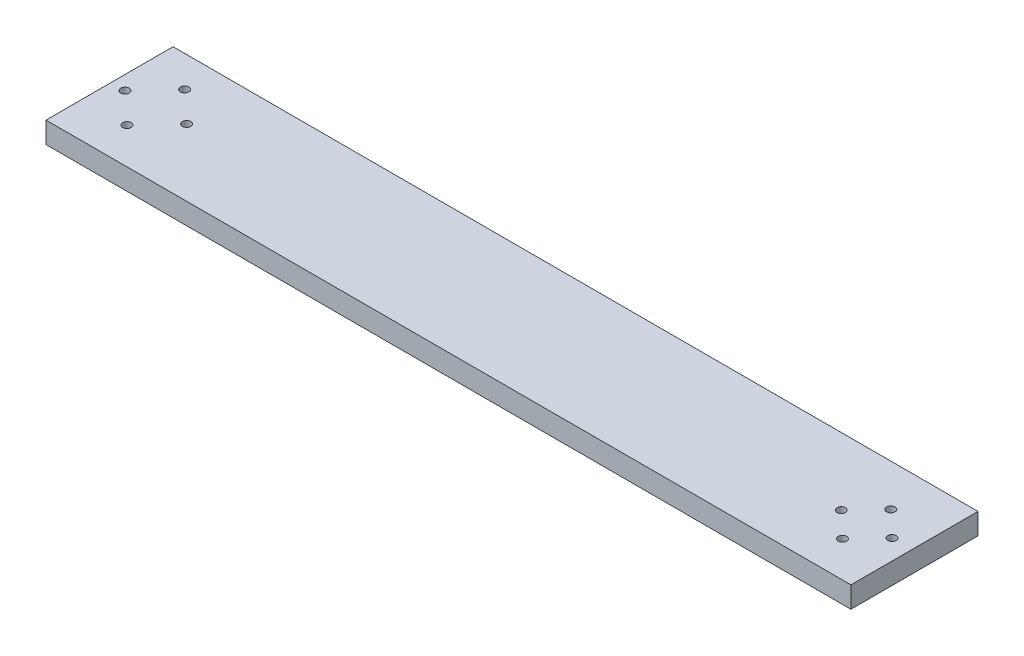
ISO-10303-21;
HEADER;
FILE_DESCRIPTION(('STEP AP214'),'2;1');
FILE_NAME('part.step','',(''),(''),'','','');
FILE_SCHEMA(('AUTOMOTIVE_DESIGN { 1 0 10303 214 1 1 1 1 }'));
ENDSEC;
DATA;
#1=APPLICATION_CONTEXT('core data for automotive mechanical design processes');
#2=APPLICATION_PROTOCOL_DEFINITION('international standard','automotive_design',2000,#1);
#3=PRODUCT_CONTEXT('',#1,'mechanical');
#4=PRODUCT('Part','Part','',(#3));
#5=PRODUCT_RELATED_PRODUCT_CATEGORY('part','',(#4));
#6=PRODUCT_DEFINITION_FORMATION('','',#4);
#7=PRODUCT_DEFINITION_CONTEXT('part definition',#1,'design');
#8=PRODUCT_DEFINITION('design','',#6,#7);
#9=PRODUCT_DEFINITION_SHAPE('','',#8);
#10=(LENGTH_UNIT() NAMED_UNIT(*) SI_UNIT(.MILLI.,.METRE.));
#11=(NAMED_UNIT(*) PLANE_ANGLE_UNIT() SI_UNIT($,.RADIAN.));
#12=(NAMED_UNIT(*) SI_UNIT($,.STERADIAN.) SOLID_ANGLE_UNIT());
#13=UNCERTAINTY_MEASURE_WITH_UNIT(LENGTH_MEASURE(1.E-05),#10,'distance_accuracy_value','');
#14=(GEOMETRIC_REPRESENTATION_CONTEXT(3) GLOBAL_UNCERTAINTY_ASSIGNED_CONTEXT((#13)) GLOBAL_UNIT_ASSIGNED_CONTEXT((#10,
#11,#12)) REPRESENTATION_CONTEXT('',''));
#15=CARTESIAN_POINT('',(0.,0.,0.));
#16=DIRECTION('',(0.,0.,1.));
#17=DIRECTION('',(1.,0.,0.));
#18=AXIS2_PLACEMENT_3D('',#15,#16,#17);
#19=CARTESIAN_POINT('',(0.,5.,0.));
#20=DIRECTION('',(1.,0.,0.));
#21=DIRECTION('',(0.,0.,-1.));
#22=AXIS2_PLACEMENT_3D('',#19,#20,#21);
#23=PLANE('',#22);
#24=DIRECTION('',(0.,0.,1.));
#25=VECTOR('',#24,1.);
#26=CARTESIAN_POINT('',(0.,0.,0.));
#27=LINE('',#26,#25);
#28=CARTESIAN_POINT('',(0.,0.,-30.));
#29=VERTEX_POINT('',#28);
#30=CARTESIAN_POINT('',(0.,0.,0.));
#31=VERTEX_POINT('',#30);
#32=EDGE_CURVE('E107',#29,#31,#27,.T.);
#33=ORIENTED_EDGE('',*,*,#32,.T.);
#34=DIRECTION('',(0.,-1.,0.));
#35=VECTOR('',#34,1.);
#36=CARTESIAN_POINT('',(0.,5.,0.));
#37=LINE('',#36,#35);
#38=CARTESIAN_POINT('',(0.,5.,0.));
#39=VERTEX_POINT('',#38);
#40=EDGE_CURVE('E11',#39,#31,#37,.T.);
#41=ORIENTED_EDGE('',*,*,#40,.F.);
#42=DIRECTION('',(0.,0.,1.));
#43=VECTOR('',#42,1.);
#44=CARTESIAN_POINT('',(0.,5.,0.));
#45=LINE('',#44,#43);
#46=CARTESIAN_POINT('',(0.,5.,-30.));
#47=VERTEX_POINT('',#46);
#48=EDGE_CURVE('E91',#47,#39,#45,.T.);
#49=ORIENTED_EDGE('',*,*,#48,.F.);
#50=DIRECTION('',(0.,-1.,0.));
#51=VECTOR('',#50,1.);
#52=CARTESIAN_POINT('',(0.,5.,-30.));
#53=LINE('',#52,#51);
#54=EDGE_CURVE('E103',#47,#29,#53,.T.);
#55=ORIENTED_EDGE('',*,*,#54,.T.);
#56=EDGE_LOOP('',(#33,#41,#49,#55));
#57=FACE_BOUND('',#56,.T.);
#58=ADVANCED_FACE('F39',(#57),#23,.F.);
#59=CARTESIAN_POINT('',(0.,5.,0.));
#60=DIRECTION('',(0.,0.,-1.));
#61=DIRECTION('',(-1.,0.,0.));
#62=AXIS2_PLACEMENT_3D('',#59,#60,#61);
#63=PLANE('',#62);
#64=DIRECTION('',(1.,0.,0.));
#65=VECTOR('',#64,1.);
#66=CARTESIAN_POINT('',(0.,0.,0.));
#67=LINE('',#66,#65);
#68=CARTESIAN_POINT('',(190.,0.,0.));
#69=VERTEX_POINT('',#68);
#70=EDGE_CURVE('E96',#31,#69,#67,.T.);
#71=ORIENTED_EDGE('',*,*,#70,.T.);
#72=DIRECTION('',(0.,-1.,0.));
#73=VECTOR('',#72,1.);
#74=CARTESIAN_POINT('',(190.,5.,0.));
#75=LINE('',#74,#73);
#76=CARTESIAN_POINT('',(190.,5.,0.));
#77=VERTEX_POINT('',#76);
#78=EDGE_CURVE('E48',#77,#69,#75,.T.);
#79=ORIENTED_EDGE('',*,*,#78,.F.);
#80=DIRECTION('',(1.,0.,0.));
#81=VECTOR('',#80,1.);
#82=CARTESIAN_POINT('',(0.,5.,0.));
#83=LINE('',#82,#81);
#84=EDGE_CURVE('E86',#39,#77,#83,.T.);
#85=ORIENTED_EDGE('',*,*,#84,.F.);
#86=ORIENTED_EDGE('',*,*,#40,.T.);
#87=EDGE_LOOP('',(#71,#79,#85,#86));
#88=FACE_BOUND('',#87,.T.);
#89=ADVANCED_FACE('F95',(#88),#63,.F.);
#90=CARTESIAN_POINT('',(190.,5.,0.));
#91=DIRECTION('',(-1.,0.,0.));
#92=DIRECTION('',(0.,0.,1.));
#93=AXIS2_PLACEMENT_3D('',#90,#91,#92);
#94=PLANE('',#93);
#95=DIRECTION('',(0.,0.,-1.));
#96=VECTOR('',#95,1.);
#97=CARTESIAN_POINT('',(190.,0.,0.));
#98=LINE('',#97,#96);
#99=CARTESIAN_POINT('',(190.,0.,-30.));
#100=VERTEX_POINT('',#99);
#101=EDGE_CURVE('E73',#69,#100,#98,.T.);
#102=ORIENTED_EDGE('',*,*,#101,.T.);
#103=DIRECTION('',(0.,-1.,0.));
#104=VECTOR('',#103,1.);
#105=CARTESIAN_POINT('',(190.,5.,-30.));
#106=LINE('',#105,#104);
#107=CARTESIAN_POINT('',(190.,5.,-30.));
#108=VERTEX_POINT('',#107);
#109=EDGE_CURVE('E98',#108,#100,#106,.T.);
#110=ORIENTED_EDGE('',*,*,#109,.F.);
#111=DIRECTION('',(0.,0.,-1.));
#112=VECTOR('',#111,1.);
#113=CARTESIAN_POINT('',(190.,5.,0.));
#114=LINE('',#113,#112);
#115=EDGE_CURVE('E89',#77,#108,#114,.T.);
#116=ORIENTED_EDGE('',*,*,#115,.F.);
#117=ORIENTED_EDGE('',*,*,#78,.T.);
#118=EDGE_LOOP('',(#102,#110,#116,#117));
#119=FACE_BOUND('',#118,.T.);
#120=ADVANCED_FACE('F99',(#119),#94,.F.);
#121=CARTESIAN_POINT('',(0.,5.,-30.));
#122=DIRECTION('',(0.,0.,1.));
#123=DIRECTION('',(1.,0.,0.));
#124=AXIS2_PLACEMENT_3D('',#121,#122,#123);
#125=PLANE('',#124);
#126=DIRECTION('',(-1.,0.,0.));
#127=VECTOR('',#126,1.);
#128=CARTESIAN_POINT('',(0.,0.,-30.));
#129=LINE('',#128,#127);
#130=EDGE_CURVE('E79',#100,#29,#129,.T.);
#131=ORIENTED_EDGE('',*,*,#130,.T.);
#132=ORIENTED_EDGE('',*,*,#54,.F.);
#133=DIRECTION('',(-1.,0.,0.));
#134=VECTOR('',#133,1.);
#135=CARTESIAN_POINT('',(0.,5.,-30.));
#136=LINE('',#135,#134);
#137=EDGE_CURVE('E56',#108,#47,#136,.T.);
#138=ORIENTED_EDGE('',*,*,#137,.F.);
#139=ORIENTED_EDGE('',*,*,#109,.T.);
#140=EDGE_LOOP('',(#131,#132,#138,#139));
#141=FACE_BOUND('',#140,.T.);
#142=ADVANCED_FACE('F121',(#141),#125,.F.);
#143=CARTESIAN_POINT('',(0.,5.,0.));
#144=DIRECTION('',(0.,-1.,0.));
#145=DIRECTION('',(0.,0.,-1.));
#146=AXIS2_PLACEMENT_3D('',#143,#144,#145);
#147=PLANE('',#146);
#148=CARTESIAN_POINT('',(185.293524886373,5.,-14.4211953532925));
#149=DIRECTION('',(0.,1.,0.));
#150=DIRECTION('',(0.,0.,1.));
#151=AXIS2_PLACEMENT_3D('',#148,#149,#150);
#152=CIRCLE('',#151,0.999999999999998);
#153=CARTESIAN_POINT('',(185.293524886373,5.,-13.4211953532925));
#154=VERTEX_POINT('',#153);
#155=EDGE_CURVE('E145',#154,#154,#152,.T.);
#156=ORIENTED_EDGE('',*,*,#155,.F.);
#157=EDGE_LOOP('',(#156));
#158=FACE_BOUND('',#157,.T.);
#159=CARTESIAN_POINT('',(10.5689874196251,5.,-8.52535766093869));
#160=DIRECTION('',(0.,1.,0.));
#161=DIRECTION('',(0.,0.,1.));
#162=AXIS2_PLACEMENT_3D('',#159,#160,#161);
#163=CIRCLE('',#162,0.999999999999999);
#164=CARTESIAN_POINT('',(10.5689874196251,5.,-7.5253576609387));
#165=VERTEX_POINT('',#164);
#166=EDGE_CURVE('E162',#165,#165,#163,.T.);
#167=ORIENTED_EDGE('',*,*,#166,.F.);
#168=EDGE_LOOP('',(#167));
#169=FACE_BOUND('',#168,.T.);
#170=CARTESIAN_POINT('',(17.3855977046133,5.,-15.8090447309714));
#171=DIRECTION('',(0.,1.,0.));
#172=DIRECTION('',(0.,0.,1.));
#173=AXIS2_PLACEMENT_3D('',#170,#171,#172);
#174=CIRCLE('',#173,0.999999999999999);
#175=CARTESIAN_POINT('',(17.3855977046133,5.,-14.8090447309714));
#176=VERTEX_POINT('',#175);
#177=EDGE_CURVE('E170',#176,#176,#174,.T.);
#178=ORIENTED_EDGE('',*,*,#177,.F.);
#179=EDGE_LOOP('',(#178));
#180=FACE_BOUND('',#179,.T.);
#181=CARTESIAN_POINT('',(10.1019106345805,5.,-22.6256550159595));
#182=DIRECTION('',(0.,1.,0.));
#183=DIRECTION('',(0.,0.,1.));
#184=AXIS2_PLACEMENT_3D('',#181,#182,#183);
#185=CIRCLE('',#184,0.999999999999997);
#186=CARTESIAN_POINT('',(10.1019106345805,5.,-21.6256550159595));
#187=VERTEX_POINT('',#186);
#188=EDGE_CURVE('E178',#187,#187,#185,.T.);
#189=ORIENTED_EDGE('',*,*,#188,.F.);
#190=EDGE_LOOP('',(#189));
#191=FACE_BOUND('',#190,.T.);
#192=CARTESIAN_POINT('',(3.28530034959241,5.,-15.3419679459267));
#193=DIRECTION('',(0.,1.,0.));
#194=DIRECTION('',(0.,0.,1.));
#195=AXIS2_PLACEMENT_3D('',#192,#193,#194);
#196=CIRCLE('',#195,1.);
#197=CARTESIAN_POINT('',(3.28530034959241,5.,-14.3419679459267));
#198=VERTEX_POINT('',#197);
#199=EDGE_CURVE('E137',#198,#198,#196,.T.);
#200=ORIENTED_EDGE('',*,*,#199,.F.);
#201=EDGE_LOOP('',(#200));
#202=FACE_BOUND('',#201,.T.);
#203=CARTESIAN_POINT('',(179.593429877671,5.,-8.42503684206408));
#204=DIRECTION('',(0.,1.,0.));
#205=DIRECTION('',(0.,0.,1.));
#206=AXIS2_PLACEMENT_3D('',#203,#204,#205);
#207=CIRCLE('',#206,0.999999999999998);
#208=CARTESIAN_POINT('',(179.593429877671,5.,-7.42503684206408));
#209=VERTEX_POINT('',#208);
#210=EDGE_CURVE('E128',#209,#209,#207,.T.);
#211=ORIENTED_EDGE('',*,*,#210,.F.);
#212=EDGE_LOOP('',(#211));
#213=FACE_BOUND('',#212,.T.);
#214=CARTESIAN_POINT('',(173.597271366443,5.,-14.1251318507656));
#215=DIRECTION('',(0.,1.,0.));
#216=DIRECTION('',(0.,0.,1.));
#217=AXIS2_PLACEMENT_3D('',#214,#215,#216);
#218=CIRCLE('',#217,0.999999999999996);
#219=CARTESIAN_POINT('',(173.597271366443,5.,-13.1251318507656));
#220=VERTEX_POINT('',#219);
#221=EDGE_CURVE('E155',#220,#220,#218,.T.);
#222=ORIENTED_EDGE('',*,*,#221,.F.);
#223=EDGE_LOOP('',(#222));
#224=FACE_BOUND('',#223,.T.);
#225=CARTESIAN_POINT('',(179.297366375145,5.,-20.1212903619939));
#226=DIRECTION('',(0.,1.,0.));
#227=DIRECTION('',(0.,0.,1.));
#228=AXIS2_PLACEMENT_3D('',#225,#226,#227);
#229=CIRCLE('',#228,1.00000000000002);
#230=CARTESIAN_POINT('',(179.297366375145,5.,-19.1212903619939));
#231=VERTEX_POINT('',#230);
#232=EDGE_CURVE('E146',#231,#231,#229,.T.);
#233=ORIENTED_EDGE('',*,*,#232,.F.);
#234=EDGE_LOOP('',(#233));
#235=FACE_BOUND('',#234,.T.);
#236=ORIENTED_EDGE('',*,*,#48,.T.);
#237=ORIENTED_EDGE('',*,*,#84,.T.);
#238=ORIENTED_EDGE('',*,*,#115,.T.);
#239=ORIENTED_EDGE('',*,*,#137,.T.);
#240=EDGE_LOOP('',(#236,#237,#238,#239));
#241=FACE_BOUND('',#240,.T.);
#242=ADVANCED_FACE('F87',(#158,#169,#180,#191,#202,#213,#224,#235,#241),#147,.F.);
#243=CARTESIAN_POINT('',(0.,0.,0.));
#244=DIRECTION('',(0.,-1.,0.));
#245=DIRECTION('',(0.,0.,-1.));
#246=AXIS2_PLACEMENT_3D('',#243,#244,#245);
#247=PLANE('',#246);
#248=CARTESIAN_POINT('',(185.293524886373,0.,-14.4211953532925));
#249=DIRECTION('',(0.,1.,0.));
#250=DIRECTION('',(0.,0.,1.));
#251=AXIS2_PLACEMENT_3D('',#248,#249,#250);
#252=CIRCLE('',#251,0.999999999999998);
#253=CARTESIAN_POINT('',(185.293524886373,0.,-13.4211953532925));
#254=VERTEX_POINT('',#253);
#255=EDGE_CURVE('E111',#254,#254,#252,.T.);
#256=ORIENTED_EDGE('',*,*,#255,.T.);
#257=EDGE_LOOP('',(#256));
#258=FACE_BOUND('',#257,.T.);
#259=CARTESIAN_POINT('',(10.5689874196251,0.,-8.52535766093869));
#260=DIRECTION('',(0.,1.,0.));
#261=DIRECTION('',(0.,0.,1.));
#262=AXIS2_PLACEMENT_3D('',#259,#260,#261);
#263=CIRCLE('',#262,0.999999999999999);
#264=CARTESIAN_POINT('',(10.5689874196251,0.,-7.5253576609387));
#265=VERTEX_POINT('',#264);
#266=EDGE_CURVE('E166',#265,#265,#263,.T.);
#267=ORIENTED_EDGE('',*,*,#266,.T.);
#268=EDGE_LOOP('',(#267));
#269=FACE_BOUND('',#268,.T.);
#270=CARTESIAN_POINT('',(17.3855977046133,0.,-15.8090447309714));
#271=DIRECTION('',(0.,1.,0.));
#272=DIRECTION('',(0.,0.,1.));
#273=AXIS2_PLACEMENT_3D('',#270,#271,#272);
#274=CIRCLE('',#273,0.999999999999999);
#275=CARTESIAN_POINT('',(17.3855977046133,0.,-14.8090447309714));
#276=VERTEX_POINT('',#275);
#277=EDGE_CURVE('E174',#276,#276,#274,.T.);
#278=ORIENTED_EDGE('',*,*,#277,.T.);
#279=EDGE_LOOP('',(#278));
#280=FACE_BOUND('',#279,.T.);
#281=CARTESIAN_POINT('',(10.1019106345805,0.,-22.6256550159595));
#282=DIRECTION('',(0.,1.,0.));
#283=DIRECTION('',(0.,0.,1.));
#284=AXIS2_PLACEMENT_3D('',#281,#282,#283);
#285=CIRCLE('',#284,0.999999999999997);
#286=CARTESIAN_POINT('',(10.1019106345805,0.,-21.6256550159595));
#287=VERTEX_POINT('',#286);
#288=EDGE_CURVE('E151',#287,#287,#285,.T.);
#289=ORIENTED_EDGE('',*,*,#288,.T.);
#290=EDGE_LOOP('',(#289));
#291=FACE_BOUND('',#290,.T.);
#292=CARTESIAN_POINT('',(3.28530034959241,0.,-15.3419679459267));
#293=DIRECTION('',(0.,1.,0.));
#294=DIRECTION('',(0.,0.,1.));
#295=AXIS2_PLACEMENT_3D('',#292,#293,#294);
#296=CIRCLE('',#295,1.);
#297=CARTESIAN_POINT('',(3.28530034959241,0.,-14.3419679459267));
#298=VERTEX_POINT('',#297);
#299=EDGE_CURVE('E141',#298,#298,#296,.T.);
#300=ORIENTED_EDGE('',*,*,#299,.T.);
#301=EDGE_LOOP('',(#300));
#302=FACE_BOUND('',#301,.T.);
#303=CARTESIAN_POINT('',(179.593429877671,0.,-8.42503684206408));
#304=DIRECTION('',(0.,1.,0.));
#305=DIRECTION('',(0.,0.,1.));
#306=AXIS2_PLACEMENT_3D('',#303,#304,#305);
#307=CIRCLE('',#306,0.999999999999998);
#308=CARTESIAN_POINT('',(179.593429877671,0.,-7.42503684206408));
#309=VERTEX_POINT('',#308);
#310=EDGE_CURVE('E132',#309,#309,#307,.T.);
#311=ORIENTED_EDGE('',*,*,#310,.T.);
#312=EDGE_LOOP('',(#311));
#313=FACE_BOUND('',#312,.T.);
#314=CARTESIAN_POINT('',(173.597271366443,0.,-14.1251318507656));
#315=DIRECTION('',(0.,1.,0.));
#316=DIRECTION('',(0.,0.,1.));
#317=AXIS2_PLACEMENT_3D('',#314,#315,#316);
#318=CIRCLE('',#317,0.999999999999996);
#319=CARTESIAN_POINT('',(173.597271366443,0.,-13.1251318507656));
#320=VERTEX_POINT('',#319);
#321=EDGE_CURVE('E133',#320,#320,#318,.T.);
#322=ORIENTED_EDGE('',*,*,#321,.T.);
#323=EDGE_LOOP('',(#322));
#324=FACE_BOUND('',#323,.T.);
#325=CARTESIAN_POINT('',(179.297366375145,0.,-20.1212903619939));
#326=DIRECTION('',(0.,1.,0.));
#327=DIRECTION('',(0.,0.,1.));
#328=AXIS2_PLACEMENT_3D('',#325,#326,#327);
#329=CIRCLE('',#328,1.00000000000002);
#330=CARTESIAN_POINT('',(179.297366375145,0.,-19.1212903619939));
#331=VERTEX_POINT('',#330);
#332=EDGE_CURVE('E150',#331,#331,#329,.T.);
#333=ORIENTED_EDGE('',*,*,#332,.T.);
#334=EDGE_LOOP('',(#333));
#335=FACE_BOUND('',#334,.T.);
#336=ORIENTED_EDGE('',*,*,#32,.F.);
#337=ORIENTED_EDGE('',*,*,#130,.F.);
#338=ORIENTED_EDGE('',*,*,#101,.F.);
#339=ORIENTED_EDGE('',*,*,#70,.F.);
#340=EDGE_LOOP('',(#336,#337,#338,#339));
#341=FACE_BOUND('',#340,.T.);
#342=ADVANCED_FACE('F124',(#258,#269,#280,#291,#302,#313,#324,#335,#341),#247,.T.);
#343=CARTESIAN_POINT('',(179.297366375145,0.,-20.1212903619939));
#344=DIRECTION('',(0.,1.,0.));
#345=DIRECTION('',(0.,0.,1.));
#346=AXIS2_PLACEMENT_3D('',#343,#344,#345);
#347=CYLINDRICAL_SURFACE('',#346,1.00000000000002);
#348=ORIENTED_EDGE('',*,*,#332,.F.);
#349=EDGE_LOOP('',(#348));
#350=FACE_BOUND('',#349,.T.);
#351=ORIENTED_EDGE('',*,*,#232,.T.);
#352=EDGE_LOOP('',(#351));
#353=FACE_BOUND('',#352,.T.);
#354=ADVANCED_FACE('F218',(#350,#353),#347,.F.);
#355=CARTESIAN_POINT('',(173.597271366443,0.,-14.1251318507656));
#356=DIRECTION('',(0.,1.,0.));
#357=DIRECTION('',(0.,0.,1.));
#358=AXIS2_PLACEMENT_3D('',#355,#356,#357);
#359=CYLINDRICAL_SURFACE('',#358,0.999999999999996);
#360=ORIENTED_EDGE('',*,*,#321,.F.);
#361=EDGE_LOOP('',(#360));
#362=FACE_BOUND('',#361,.T.);
#363=ORIENTED_EDGE('',*,*,#221,.T.);
#364=EDGE_LOOP('',(#363));
#365=FACE_BOUND('',#364,.T.);
#366=ADVANCED_FACE('F220',(#362,#365),#359,.F.);
#367=CARTESIAN_POINT('',(179.593429877671,0.,-8.42503684206408));
#368=DIRECTION('',(0.,1.,0.));
#369=DIRECTION('',(0.,0.,1.));
#370=AXIS2_PLACEMENT_3D('',#367,#368,#369);
#371=CYLINDRICAL_SURFACE('',#370,0.999999999999998);
#372=ORIENTED_EDGE('',*,*,#310,.F.);
#373=EDGE_LOOP('',(#372));
#374=FACE_BOUND('',#373,.T.);
#375=ORIENTED_EDGE('',*,*,#210,.T.);
#376=EDGE_LOOP('',(#375));
#377=FACE_BOUND('',#376,.T.);
#378=ADVANCED_FACE('F227',(#374,#377),#371,.F.);
#379=CARTESIAN_POINT('',(3.28530034959241,0.,-15.3419679459267));
#380=DIRECTION('',(0.,1.,0.));
#381=DIRECTION('',(0.,0.,1.));
#382=AXIS2_PLACEMENT_3D('',#379,#380,#381);
#383=CYLINDRICAL_SURFACE('',#382,1.);
#384=ORIENTED_EDGE('',*,*,#299,.F.);
#385=EDGE_LOOP('',(#384));
#386=FACE_BOUND('',#385,.T.);
#387=ORIENTED_EDGE('',*,*,#199,.T.);
#388=EDGE_LOOP('',(#387));
#389=FACE_BOUND('',#388,.T.);
#390=ADVANCED_FACE('F245',(#386,#389),#383,.F.);
#391=CARTESIAN_POINT('',(10.1019106345805,0.,-22.6256550159595));
#392=DIRECTION('',(0.,1.,0.));
#393=DIRECTION('',(0.,0.,1.));
#394=AXIS2_PLACEMENT_3D('',#391,#392,#393);
#395=CYLINDRICAL_SURFACE('',#394,0.999999999999997);
#396=ORIENTED_EDGE('',*,*,#288,.F.);
#397=EDGE_LOOP('',(#396));
#398=FACE_BOUND('',#397,.T.);
#399=ORIENTED_EDGE('',*,*,#188,.T.);
#400=EDGE_LOOP('',(#399));
#401=FACE_BOUND('',#400,.T.);
#402=ADVANCED_FACE('F248',(#398,#401),#395,.F.);
#403=CARTESIAN_POINT('',(17.3855977046133,0.,-15.8090447309714));
#404=DIRECTION('',(0.,1.,0.));
#405=DIRECTION('',(0.,0.,1.));
#406=AXIS2_PLACEMENT_3D('',#403,#404,#405);
#407=CYLINDRICAL_SURFACE('',#406,0.999999999999999);
#408=ORIENTED_EDGE('',*,*,#277,.F.);
#409=EDGE_LOOP('',(#408));
#410=FACE_BOUND('',#409,.T.);
#411=ORIENTED_EDGE('',*,*,#177,.T.);
#412=EDGE_LOOP('',(#411));
#413=FACE_BOUND('',#412,.T.);
#414=ADVANCED_FACE('F253',(#410,#413),#407,.F.);
#415=CARTESIAN_POINT('',(10.5689874196251,0.,-8.52535766093869));
#416=DIRECTION('',(0.,1.,0.));
#417=DIRECTION('',(0.,0.,1.));
#418=AXIS2_PLACEMENT_3D('',#415,#416,#417);
#419=CYLINDRICAL_SURFACE('',#418,0.999999999999999);
#420=ORIENTED_EDGE('',*,*,#266,.F.);
#421=EDGE_LOOP('',(#420));
#422=FACE_BOUND('',#421,.T.);
#423=ORIENTED_EDGE('',*,*,#166,.T.);
#424=EDGE_LOOP('',(#423));
#425=FACE_BOUND('',#424,.T.);
#426=ADVANCED_FACE('F197',(#422,#425),#419,.F.);
#427=CARTESIAN_POINT('',(185.293524886373,0.,-14.4211953532925));
#428=DIRECTION('',(0.,1.,0.));
#429=DIRECTION('',(0.,0.,1.));
#430=AXIS2_PLACEMENT_3D('',#427,#428,#429);
#431=CYLINDRICAL_SURFACE('',#430,0.999999999999998);
#432=ORIENTED_EDGE('',*,*,#255,.F.);
#433=EDGE_LOOP('',(#432));
#434=FACE_BOUND('',#433,.T.);
#435=ORIENTED_EDGE('',*,*,#155,.T.);
#436=EDGE_LOOP('',(#435));
#437=FACE_BOUND('',#436,.T.);
#438=ADVANCED_FACE('F194',(#434,#437),#431,.F.);
#439=CLOSED_SHELL('',(#58,#89,#120,#142,#242,#342,#354,#366,#378,#390,#402,#414,#426,#438));
#440=MANIFOLD_SOLID_BREP('B2',#439);
#441=ADVANCED_BREP_SHAPE_REPRESENTATION('',(#18,#440),#14);
#442=SHAPE_DEFINITION_REPRESENTATION(#9,#441);
ENDSEC;
END-ISO-10303-21;
